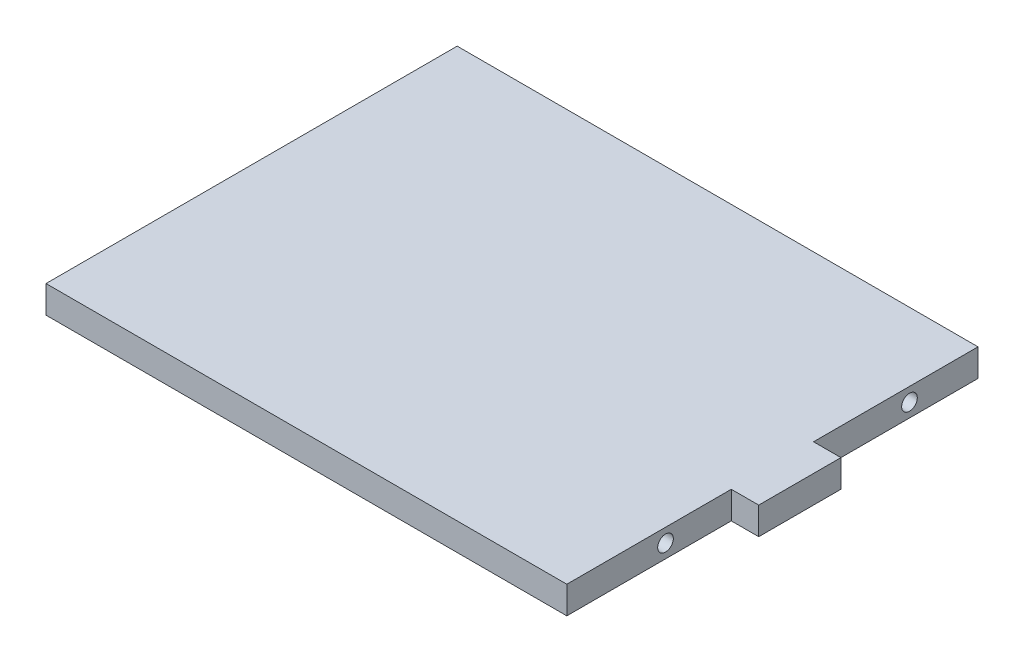
ISO-10303-21;
HEADER;
FILE_DESCRIPTION(('STEP AP214'),'2;1');
FILE_NAME('part.step','',(''),(''),'','','');
FILE_SCHEMA(('AUTOMOTIVE_DESIGN { 1 0 10303 214 1 1 1 1 }'));
ENDSEC;
DATA;
#1=APPLICATION_CONTEXT('core data for automotive mechanical design processes');
#2=APPLICATION_PROTOCOL_DEFINITION('international standard','automotive_design',2000,#1);
#3=PRODUCT_CONTEXT('',#1,'mechanical');
#4=PRODUCT('Part','Part','',(#3));
#5=PRODUCT_RELATED_PRODUCT_CATEGORY('part','',(#4));
#6=PRODUCT_DEFINITION_FORMATION('','',#4);
#7=PRODUCT_DEFINITION_CONTEXT('part definition',#1,'design');
#8=PRODUCT_DEFINITION('design','',#6,#7);
#9=PRODUCT_DEFINITION_SHAPE('','',#8);
#10=(LENGTH_UNIT() NAMED_UNIT(*) SI_UNIT(.MILLI.,.METRE.));
#11=(NAMED_UNIT(*) PLANE_ANGLE_UNIT() SI_UNIT($,.RADIAN.));
#12=(NAMED_UNIT(*) SI_UNIT($,.STERADIAN.) SOLID_ANGLE_UNIT());
#13=UNCERTAINTY_MEASURE_WITH_UNIT(LENGTH_MEASURE(1.E-05),#10,'distance_accuracy_value','');
#14=(GEOMETRIC_REPRESENTATION_CONTEXT(3) GLOBAL_UNCERTAINTY_ASSIGNED_CONTEXT((#13)) GLOBAL_UNIT_ASSIGNED_CONTEXT((#10,
#11,#12)) REPRESENTATION_CONTEXT('',''));
#15=CARTESIAN_POINT('',(0.,0.,0.));
#16=DIRECTION('',(0.,0.,1.));
#17=DIRECTION('',(1.,0.,0.));
#18=AXIS2_PLACEMENT_3D('',#15,#16,#17);
#19=CARTESIAN_POINT('',(47.5,5.,37.5));
#20=DIRECTION('',(-1.,0.,0.));
#21=DIRECTION('',(0.,0.,1.));
#22=AXIS2_PLACEMENT_3D('',#19,#20,#21);
#23=PLANE('',#22);
#24=CARTESIAN_POINT('',(47.5,2.5,19.5));
#25=DIRECTION('',(1.,0.,0.));
#26=DIRECTION('',(0.,0.,-1.));
#27=AXIS2_PLACEMENT_3D('',#24,#25,#26);
#28=CIRCLE('',#27,1.425);
#29=CARTESIAN_POINT('',(47.5,2.5,18.075));
#30=VERTEX_POINT('',#29);
#31=EDGE_CURVE('E280',#30,#30,#28,.T.);
#32=ORIENTED_EDGE('',*,*,#31,.F.);
#33=EDGE_LOOP('',(#32));
#34=FACE_BOUND('',#33,.T.);
#35=DIRECTION('',(0.,-1.,0.));
#36=VECTOR('',#35,1.);
#37=CARTESIAN_POINT('',(47.5,5.,7.5));
#38=LINE('',#37,#36);
#39=CARTESIAN_POINT('',(47.5,5.,7.5));
#40=VERTEX_POINT('',#39);
#41=CARTESIAN_POINT('',(47.5,0.,7.5));
#42=VERTEX_POINT('',#41);
#43=EDGE_CURVE('E59',#40,#42,#38,.T.);
#44=ORIENTED_EDGE('',*,*,#43,.F.);
#45=DIRECTION('',(0.,0.,-1.));
#46=VECTOR('',#45,1.);
#47=CARTESIAN_POINT('',(47.5,5.,37.5));
#48=LINE('',#47,#46);
#49=CARTESIAN_POINT('',(47.5,5.,37.5));
#50=VERTEX_POINT('',#49);
#51=EDGE_CURVE('E156',#50,#40,#48,.T.);
#52=ORIENTED_EDGE('',*,*,#51,.F.);
#53=DIRECTION('',(0.,-1.,0.));
#54=VECTOR('',#53,1.);
#55=CARTESIAN_POINT('',(47.5,5.,37.5));
#56=LINE('',#55,#54);
#57=CARTESIAN_POINT('',(47.5,0.,37.5));
#58=VERTEX_POINT('',#57);
#59=EDGE_CURVE('E52',#50,#58,#56,.T.);
#60=ORIENTED_EDGE('',*,*,#59,.T.);
#61=DIRECTION('',(0.,0.,-1.));
#62=VECTOR('',#61,1.);
#63=CARTESIAN_POINT('',(47.5,0.,37.5));
#64=LINE('',#63,#62);
#65=EDGE_CURVE('E166',#58,#42,#64,.T.);
#66=ORIENTED_EDGE('',*,*,#65,.T.);
#67=EDGE_LOOP('',(#44,#52,#60,#66));
#68=FACE_BOUND('',#67,.T.);
#69=ADVANCED_FACE('F43',(#34,#68),#23,.F.);
#70=CARTESIAN_POINT('',(47.5,2.5,-25.));
#71=DIRECTION('',(1.,0.,0.));
#72=DIRECTION('',(0.,0.,-1.));
#73=AXIS2_PLACEMENT_3D('',#70,#71,#72);
#74=CIRCLE('',#73,1.425);
#75=CARTESIAN_POINT('',(47.5,2.5,-26.425));
#76=VERTEX_POINT('',#75);
#77=EDGE_CURVE('E281',#76,#76,#74,.T.);
#78=ORIENTED_EDGE('',*,*,#77,.F.);
#79=EDGE_LOOP('',(#78));
#80=FACE_BOUND('',#79,.T.);
#81=DIRECTION('',(0.,1.,0.));
#82=VECTOR('',#81,1.);
#83=CARTESIAN_POINT('',(47.5,5.,-7.50000000000001));
#84=LINE('',#83,#82);
#85=CARTESIAN_POINT('',(47.5,0.,-7.50000000000001));
#86=VERTEX_POINT('',#85);
#87=CARTESIAN_POINT('',(47.5,5.,-7.50000000000001));
#88=VERTEX_POINT('',#87);
#89=EDGE_CURVE('E67',#86,#88,#84,.T.);
#90=ORIENTED_EDGE('',*,*,#89,.F.);
#91=CARTESIAN_POINT('',(47.5,0.,-37.5));
#92=VERTEX_POINT('',#91);
#93=EDGE_CURVE('E165',#86,#92,#64,.T.);
#94=ORIENTED_EDGE('',*,*,#93,.T.);
#95=DIRECTION('',(0.,-1.,0.));
#96=VECTOR('',#95,1.);
#97=CARTESIAN_POINT('',(47.5,5.,-37.5));
#98=LINE('',#97,#96);
#99=CARTESIAN_POINT('',(47.5,5.,-37.5));
#100=VERTEX_POINT('',#99);
#101=EDGE_CURVE('E174',#100,#92,#98,.T.);
#102=ORIENTED_EDGE('',*,*,#101,.F.);
#103=EDGE_CURVE('E155',#88,#100,#48,.T.);
#104=ORIENTED_EDGE('',*,*,#103,.F.);
#105=EDGE_LOOP('',(#90,#94,#102,#104));
#106=FACE_BOUND('',#105,.T.);
#107=ADVANCED_FACE('F212',(#80,#106),#23,.F.);
#108=CARTESIAN_POINT('',(-47.5,5.,37.5));
#109=DIRECTION('',(1.,0.,0.));
#110=DIRECTION('',(0.,0.,-1.));
#111=AXIS2_PLACEMENT_3D('',#108,#109,#110);
#112=PLANE('',#111);
#113=CARTESIAN_POINT('',(-47.5,2.5,-24.));
#114=DIRECTION('',(-1.,0.,0.));
#115=DIRECTION('',(0.,0.,1.));
#116=AXIS2_PLACEMENT_3D('',#113,#114,#115);
#117=CIRCLE('',#116,1.425);
#118=CARTESIAN_POINT('',(-47.5,2.5,-22.575));
#119=VERTEX_POINT('',#118);
#120=EDGE_CURVE('E298',#119,#119,#117,.T.);
#121=ORIENTED_EDGE('',*,*,#120,.F.);
#122=EDGE_LOOP('',(#121));
#123=FACE_BOUND('',#122,.T.);
#124=CARTESIAN_POINT('',(-47.5,2.5,13.));
#125=DIRECTION('',(-1.,0.,0.));
#126=DIRECTION('',(0.,0.,1.));
#127=AXIS2_PLACEMENT_3D('',#124,#125,#126);
#128=CIRCLE('',#127,1.42273181072563);
#129=CARTESIAN_POINT('',(-47.5,2.5,14.4227318107256));
#130=VERTEX_POINT('',#129);
#131=EDGE_CURVE('E293',#130,#130,#128,.T.);
#132=ORIENTED_EDGE('',*,*,#131,.F.);
#133=EDGE_LOOP('',(#132));
#134=FACE_BOUND('',#133,.T.);
#135=DIRECTION('',(0.,0.,1.));
#136=VECTOR('',#135,1.);
#137=CARTESIAN_POINT('',(-47.5,0.,37.5));
#138=LINE('',#137,#136);
#139=CARTESIAN_POINT('',(-47.5,0.,-37.5));
#140=VERTEX_POINT('',#139);
#141=CARTESIAN_POINT('',(-47.5,0.,37.5));
#142=VERTEX_POINT('',#141);
#143=EDGE_CURVE('E136',#140,#142,#138,.T.);
#144=ORIENTED_EDGE('',*,*,#143,.T.);
#145=DIRECTION('',(0.,-1.,0.));
#146=VECTOR('',#145,1.);
#147=CARTESIAN_POINT('',(-47.5,5.,37.5));
#148=LINE('',#147,#146);
#149=CARTESIAN_POINT('',(-47.5,5.,37.5));
#150=VERTEX_POINT('',#149);
#151=EDGE_CURVE('E11',#150,#142,#148,.T.);
#152=ORIENTED_EDGE('',*,*,#151,.F.);
#153=DIRECTION('',(0.,0.,1.));
#154=VECTOR('',#153,1.);
#155=CARTESIAN_POINT('',(-47.5,5.,37.5));
#156=LINE('',#155,#154);
#157=CARTESIAN_POINT('',(-47.5,5.,-37.5));
#158=VERTEX_POINT('',#157);
#159=EDGE_CURVE('E147',#158,#150,#156,.T.);
#160=ORIENTED_EDGE('',*,*,#159,.F.);
#161=DIRECTION('',(0.,-1.,0.));
#162=VECTOR('',#161,1.);
#163=CARTESIAN_POINT('',(-47.5,5.,-37.5));
#164=LINE('',#163,#162);
#165=EDGE_CURVE('E161',#158,#140,#164,.T.);
#166=ORIENTED_EDGE('',*,*,#165,.T.);
#167=EDGE_LOOP('',(#144,#152,#160,#166));
#168=FACE_BOUND('',#167,.T.);
#169=ADVANCED_FACE('F45',(#123,#134,#168),#112,.F.);
#170=CARTESIAN_POINT('',(47.5,5.,37.5));
#171=DIRECTION('',(0.,0.,-1.));
#172=DIRECTION('',(-1.,0.,0.));
#173=AXIS2_PLACEMENT_3D('',#170,#171,#172);
#174=PLANE('',#173);
#175=DIRECTION('',(1.,0.,0.));
#176=VECTOR('',#175,1.);
#177=CARTESIAN_POINT('',(47.5,0.,37.5));
#178=LINE('',#177,#176);
#179=EDGE_CURVE('E141',#142,#58,#178,.T.);
#180=ORIENTED_EDGE('',*,*,#179,.T.);
#181=ORIENTED_EDGE('',*,*,#59,.F.);
#182=DIRECTION('',(1.,0.,0.));
#183=VECTOR('',#182,1.);
#184=CARTESIAN_POINT('',(47.5,5.,37.5));
#185=LINE('',#184,#183);
#186=EDGE_CURVE('E151',#150,#50,#185,.T.);
#187=ORIENTED_EDGE('',*,*,#186,.F.);
#188=ORIENTED_EDGE('',*,*,#151,.T.);
#189=EDGE_LOOP('',(#180,#181,#187,#188));
#190=FACE_BOUND('',#189,.T.);
#191=ADVANCED_FACE('F183',(#190),#174,.F.);
#192=CARTESIAN_POINT('',(47.5,5.,-37.5));
#193=DIRECTION('',(0.,0.,1.));
#194=DIRECTION('',(1.,0.,0.));
#195=AXIS2_PLACEMENT_3D('',#192,#193,#194);
#196=PLANE('',#195);
#197=DIRECTION('',(-1.,0.,0.));
#198=VECTOR('',#197,1.);
#199=CARTESIAN_POINT('',(47.5,0.,-37.5));
#200=LINE('',#199,#198);
#201=EDGE_CURVE('E152',#92,#140,#200,.T.);
#202=ORIENTED_EDGE('',*,*,#201,.T.);
#203=ORIENTED_EDGE('',*,*,#165,.F.);
#204=DIRECTION('',(-1.,0.,0.));
#205=VECTOR('',#204,1.);
#206=CARTESIAN_POINT('',(47.5,5.,-37.5));
#207=LINE('',#206,#205);
#208=EDGE_CURVE('E159',#100,#158,#207,.T.);
#209=ORIENTED_EDGE('',*,*,#208,.F.);
#210=ORIENTED_EDGE('',*,*,#101,.T.);
#211=EDGE_LOOP('',(#202,#203,#209,#210));
#212=FACE_BOUND('',#211,.T.);
#213=ADVANCED_FACE('F189',(#212),#196,.F.);
#214=CARTESIAN_POINT('',(0.,5.,0.));
#215=DIRECTION('',(0.,1.,0.));
#216=DIRECTION('',(0.,0.,1.));
#217=AXIS2_PLACEMENT_3D('',#214,#215,#216);
#218=PLANE('',#217);
#219=ORIENTED_EDGE('',*,*,#159,.T.);
#220=ORIENTED_EDGE('',*,*,#186,.T.);
#221=ORIENTED_EDGE('',*,*,#51,.T.);
#222=DIRECTION('',(-1.,0.,0.));
#223=VECTOR('',#222,1.);
#224=CARTESIAN_POINT('',(52.5,5.,7.5));
#225=LINE('',#224,#223);
#226=CARTESIAN_POINT('',(52.5,5.,7.5));
#227=VERTEX_POINT('',#226);
#228=EDGE_CURVE('E199',#227,#40,#225,.T.);
#229=ORIENTED_EDGE('',*,*,#228,.F.);
#230=DIRECTION('',(0.,0.,1.));
#231=VECTOR('',#230,1.);
#232=CARTESIAN_POINT('',(52.5,5.,7.5));
#233=LINE('',#232,#231);
#234=CARTESIAN_POINT('',(52.5,5.,-7.50000000000001));
#235=VERTEX_POINT('',#234);
#236=EDGE_CURVE('E128',#235,#227,#233,.T.);
#237=ORIENTED_EDGE('',*,*,#236,.F.);
#238=DIRECTION('',(-1.,0.,0.));
#239=VECTOR('',#238,1.);
#240=CARTESIAN_POINT('',(52.5,5.,-7.50000000000001));
#241=LINE('',#240,#239);
#242=EDGE_CURVE('E143',#235,#88,#241,.T.);
#243=ORIENTED_EDGE('',*,*,#242,.T.);
#244=ORIENTED_EDGE('',*,*,#103,.T.);
#245=ORIENTED_EDGE('',*,*,#208,.T.);
#246=EDGE_LOOP('',(#219,#220,#221,#229,#237,#243,#244,#245));
#247=FACE_BOUND('',#246,.T.);
#248=ADVANCED_FACE('F210',(#247),#218,.T.);
#249=CARTESIAN_POINT('',(0.,0.,0.));
#250=DIRECTION('',(0.,1.,0.));
#251=DIRECTION('',(0.,0.,1.));
#252=AXIS2_PLACEMENT_3D('',#249,#250,#251);
#253=PLANE('',#252);
#254=ORIENTED_EDGE('',*,*,#143,.F.);
#255=ORIENTED_EDGE('',*,*,#201,.F.);
#256=ORIENTED_EDGE('',*,*,#93,.F.);
#257=DIRECTION('',(-1.,0.,0.));
#258=VECTOR('',#257,1.);
#259=CARTESIAN_POINT('',(52.5,0.,-7.50000000000001));
#260=LINE('',#259,#258);
#261=CARTESIAN_POINT('',(52.5,0.,-7.50000000000001));
#262=VERTEX_POINT('',#261);
#263=EDGE_CURVE('E118',#262,#86,#260,.T.);
#264=ORIENTED_EDGE('',*,*,#263,.F.);
#265=DIRECTION('',(0.,0.,-1.));
#266=VECTOR('',#265,1.);
#267=CARTESIAN_POINT('',(52.5,0.,7.5));
#268=LINE('',#267,#266);
#269=CARTESIAN_POINT('',(52.5,0.,7.5));
#270=VERTEX_POINT('',#269);
#271=EDGE_CURVE('E110',#270,#262,#268,.T.);
#272=ORIENTED_EDGE('',*,*,#271,.F.);
#273=DIRECTION('',(-1.,0.,0.));
#274=VECTOR('',#273,1.);
#275=CARTESIAN_POINT('',(52.5,0.,7.5));
#276=LINE('',#275,#274);
#277=EDGE_CURVE('E116',#270,#42,#276,.T.);
#278=ORIENTED_EDGE('',*,*,#277,.T.);
#279=ORIENTED_EDGE('',*,*,#65,.F.);
#280=ORIENTED_EDGE('',*,*,#179,.F.);
#281=EDGE_LOOP('',(#254,#255,#256,#264,#272,#278,#279,#280));
#282=FACE_BOUND('',#281,.T.);
#283=ADVANCED_FACE('F113',(#282),#253,.F.);
#284=CARTESIAN_POINT('',(52.5,5.,7.5));
#285=DIRECTION('',(0.,0.,-1.));
#286=DIRECTION('',(0.,1.,0.));
#287=AXIS2_PLACEMENT_3D('',#284,#285,#286);
#288=PLANE('',#287);
#289=ORIENTED_EDGE('',*,*,#43,.T.);
#290=ORIENTED_EDGE('',*,*,#277,.F.);
#291=DIRECTION('',(0.,-1.,0.));
#292=VECTOR('',#291,1.);
#293=CARTESIAN_POINT('',(52.5,5.,7.5));
#294=LINE('',#293,#292);
#295=EDGE_CURVE('E123',#227,#270,#294,.T.);
#296=ORIENTED_EDGE('',*,*,#295,.F.);
#297=ORIENTED_EDGE('',*,*,#228,.T.);
#298=EDGE_LOOP('',(#289,#290,#296,#297));
#299=FACE_BOUND('',#298,.T.);
#300=ADVANCED_FACE('F134',(#299),#288,.F.);
#301=CARTESIAN_POINT('',(52.5,5.,-7.50000000000001));
#302=DIRECTION('',(0.,0.,1.));
#303=DIRECTION('',(1.,0.,0.));
#304=AXIS2_PLACEMENT_3D('',#301,#302,#303);
#305=PLANE('',#304);
#306=ORIENTED_EDGE('',*,*,#89,.T.);
#307=ORIENTED_EDGE('',*,*,#242,.F.);
#308=DIRECTION('',(0.,1.,0.));
#309=VECTOR('',#308,1.);
#310=CARTESIAN_POINT('',(52.5,5.,-7.50000000000001));
#311=LINE('',#310,#309);
#312=EDGE_CURVE('E122',#262,#235,#311,.T.);
#313=ORIENTED_EDGE('',*,*,#312,.F.);
#314=ORIENTED_EDGE('',*,*,#263,.T.);
#315=EDGE_LOOP('',(#306,#307,#313,#314));
#316=FACE_BOUND('',#315,.T.);
#317=ADVANCED_FACE('F193',(#316),#305,.F.);
#318=CARTESIAN_POINT('',(52.5,0.,0.));
#319=DIRECTION('',(1.,0.,0.));
#320=DIRECTION('',(0.,0.,-1.));
#321=AXIS2_PLACEMENT_3D('',#318,#319,#320);
#322=PLANE('',#321);
#323=ORIENTED_EDGE('',*,*,#295,.T.);
#324=ORIENTED_EDGE('',*,*,#271,.T.);
#325=ORIENTED_EDGE('',*,*,#312,.T.);
#326=ORIENTED_EDGE('',*,*,#236,.T.);
#327=EDGE_LOOP('',(#323,#324,#325,#326));
#328=FACE_BOUND('',#327,.T.);
#329=ADVANCED_FACE('F126',(#328),#322,.T.);
#330=CARTESIAN_POINT('',(-22.5,2.5,13.));
#331=DIRECTION('',(-1.,0.,0.));
#332=DIRECTION('',(0.,0.,1.));
#333=AXIS2_PLACEMENT_3D('',#330,#331,#332);
#334=CYLINDRICAL_SURFACE('',#333,1.42273181072563);
#335=CARTESIAN_POINT('',(-22.5,2.5,13.));
#336=DIRECTION('',(-1.,0.,0.));
#337=DIRECTION('',(0.,0.,1.));
#338=AXIS2_PLACEMENT_3D('',#335,#336,#337);
#339=CIRCLE('',#338,1.42273181072563);
#340=CARTESIAN_POINT('',(-22.5,2.5,14.4227318107256));
#341=VERTEX_POINT('',#340);
#342=EDGE_CURVE('E302',#341,#341,#339,.T.);
#343=ORIENTED_EDGE('',*,*,#342,.F.);
#344=EDGE_LOOP('',(#343));
#345=FACE_BOUND('',#344,.T.);
#346=ORIENTED_EDGE('',*,*,#131,.T.);
#347=EDGE_LOOP('',(#346));
#348=FACE_BOUND('',#347,.T.);
#349=ADVANCED_FACE('F243',(#345,#348),#334,.F.);
#350=CARTESIAN_POINT('',(-22.5,2.5,13.));
#351=DIRECTION('',(-1.,0.,0.));
#352=DIRECTION('',(0.,0.,1.));
#353=AXIS2_PLACEMENT_3D('',#350,#351,#352);
#354=PLANE('',#353);
#355=ORIENTED_EDGE('',*,*,#342,.T.);
#356=EDGE_LOOP('',(#355));
#357=FACE_BOUND('',#356,.T.);
#358=ADVANCED_FACE('F246',(#357),#354,.T.);
#359=CARTESIAN_POINT('',(-22.5,2.5,-24.));
#360=DIRECTION('',(-1.,0.,0.));
#361=DIRECTION('',(0.,0.,1.));
#362=AXIS2_PLACEMENT_3D('',#359,#360,#361);
#363=CYLINDRICAL_SURFACE('',#362,1.425);
#364=CARTESIAN_POINT('',(-22.5,2.5,-24.));
#365=DIRECTION('',(-1.,0.,0.));
#366=DIRECTION('',(0.,0.,1.));
#367=AXIS2_PLACEMENT_3D('',#364,#365,#366);
#368=CIRCLE('',#367,1.425);
#369=CARTESIAN_POINT('',(-22.5,2.5,-22.575));
#370=VERTEX_POINT('',#369);
#371=EDGE_CURVE('E204',#370,#370,#368,.T.);
#372=ORIENTED_EDGE('',*,*,#371,.F.);
#373=EDGE_LOOP('',(#372));
#374=FACE_BOUND('',#373,.T.);
#375=ORIENTED_EDGE('',*,*,#120,.T.);
#376=EDGE_LOOP('',(#375));
#377=FACE_BOUND('',#376,.T.);
#378=ADVANCED_FACE('F250',(#374,#377),#363,.F.);
#379=CARTESIAN_POINT('',(-22.5,2.5,-24.));
#380=DIRECTION('',(-1.,0.,0.));
#381=DIRECTION('',(0.,0.,1.));
#382=AXIS2_PLACEMENT_3D('',#379,#380,#381);
#383=PLANE('',#382);
#384=ORIENTED_EDGE('',*,*,#371,.T.);
#385=EDGE_LOOP('',(#384));
#386=FACE_BOUND('',#385,.T.);
#387=ADVANCED_FACE('F254',(#386),#383,.T.);
#388=CARTESIAN_POINT('',(22.5,2.5,19.5));
#389=DIRECTION('',(1.,0.,0.));
#390=DIRECTION('',(0.,0.,-1.));
#391=AXIS2_PLACEMENT_3D('',#388,#389,#390);
#392=CYLINDRICAL_SURFACE('',#391,1.425);
#393=CARTESIAN_POINT('',(22.5,2.5,19.5));
#394=DIRECTION('',(1.,0.,0.));
#395=DIRECTION('',(0.,0.,-1.));
#396=AXIS2_PLACEMENT_3D('',#393,#394,#395);
#397=CIRCLE('',#396,1.425);
#398=CARTESIAN_POINT('',(22.5,2.5,18.075));
#399=VERTEX_POINT('',#398);
#400=EDGE_CURVE('E286',#399,#399,#397,.T.);
#401=ORIENTED_EDGE('',*,*,#400,.F.);
#402=EDGE_LOOP('',(#401));
#403=FACE_BOUND('',#402,.T.);
#404=ORIENTED_EDGE('',*,*,#31,.T.);
#405=EDGE_LOOP('',(#404));
#406=FACE_BOUND('',#405,.T.);
#407=ADVANCED_FACE('F258',(#403,#406),#392,.F.);
#408=CARTESIAN_POINT('',(22.5,2.5,19.5));
#409=DIRECTION('',(1.,0.,0.));
#410=DIRECTION('',(0.,0.,-1.));
#411=AXIS2_PLACEMENT_3D('',#408,#409,#410);
#412=PLANE('',#411);
#413=ORIENTED_EDGE('',*,*,#400,.T.);
#414=EDGE_LOOP('',(#413));
#415=FACE_BOUND('',#414,.T.);
#416=ADVANCED_FACE('F262',(#415),#412,.T.);
#417=CARTESIAN_POINT('',(22.5,2.5,-25.));
#418=DIRECTION('',(1.,0.,0.));
#419=DIRECTION('',(0.,0.,-1.));
#420=AXIS2_PLACEMENT_3D('',#417,#418,#419);
#421=CYLINDRICAL_SURFACE('',#420,1.425);
#422=CARTESIAN_POINT('',(22.5,2.5,-25.));
#423=DIRECTION('',(1.,0.,0.));
#424=DIRECTION('',(0.,0.,-1.));
#425=AXIS2_PLACEMENT_3D('',#422,#423,#424);
#426=CIRCLE('',#425,1.425);
#427=CARTESIAN_POINT('',(22.5,2.5,-26.425));
#428=VERTEX_POINT('',#427);
#429=EDGE_CURVE('E278',#428,#428,#426,.T.);
#430=ORIENTED_EDGE('',*,*,#429,.F.);
#431=EDGE_LOOP('',(#430));
#432=FACE_BOUND('',#431,.T.);
#433=ORIENTED_EDGE('',*,*,#77,.T.);
#434=EDGE_LOOP('',(#433));
#435=FACE_BOUND('',#434,.T.);
#436=ADVANCED_FACE('F266',(#432,#435),#421,.F.);
#437=CARTESIAN_POINT('',(22.5,2.5,-25.));
#438=DIRECTION('',(1.,0.,0.));
#439=DIRECTION('',(0.,0.,-1.));
#440=AXIS2_PLACEMENT_3D('',#437,#438,#439);
#441=PLANE('',#440);
#442=ORIENTED_EDGE('',*,*,#429,.T.);
#443=EDGE_LOOP('',(#442));
#444=FACE_BOUND('',#443,.T.);
#445=ADVANCED_FACE('F270',(#444),#441,.T.);
#446=CLOSED_SHELL('',(#69,#107,#169,#191,#213,#248,#283,#300,#317,#329,#349,#358,#378,#387,#407,
#416,#436,#445));
#447=MANIFOLD_SOLID_BREP('B2',#446);
#448=ADVANCED_BREP_SHAPE_REPRESENTATION('',(#18,#447),#14);
#449=SHAPE_DEFINITION_REPRESENTATION(#9,#448);
ENDSEC;
END-ISO-10303-21;
